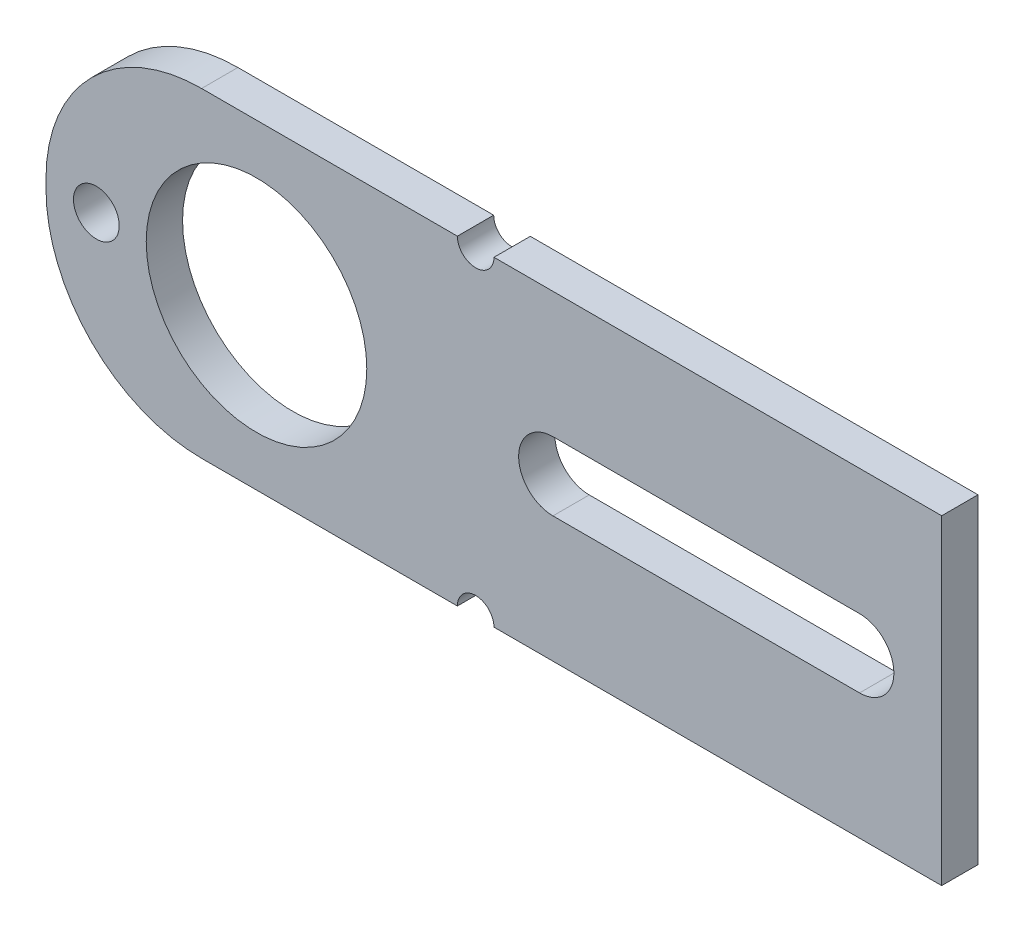
ISO-10303-21;
HEADER;
FILE_DESCRIPTION(('STEP AP214'),'2;1');
FILE_NAME('part.step','',(''),(''),'','','');
FILE_SCHEMA(('AUTOMOTIVE_DESIGN { 1 0 10303 214 1 1 1 1 }'));
ENDSEC;
DATA;
#1=APPLICATION_CONTEXT('core data for automotive mechanical design processes');
#2=APPLICATION_PROTOCOL_DEFINITION('international standard','automotive_design',2000,#1);
#3=PRODUCT_CONTEXT('',#1,'mechanical');
#4=PRODUCT('Part','Part','',(#3));
#5=PRODUCT_RELATED_PRODUCT_CATEGORY('part','',(#4));
#6=PRODUCT_DEFINITION_FORMATION('','',#4);
#7=PRODUCT_DEFINITION_CONTEXT('part definition',#1,'design');
#8=PRODUCT_DEFINITION('design','',#6,#7);
#9=PRODUCT_DEFINITION_SHAPE('','',#8);
#10=(LENGTH_UNIT() NAMED_UNIT(*) SI_UNIT(.MILLI.,.METRE.));
#11=(NAMED_UNIT(*) PLANE_ANGLE_UNIT() SI_UNIT($,.RADIAN.));
#12=(NAMED_UNIT(*) SI_UNIT($,.STERADIAN.) SOLID_ANGLE_UNIT());
#13=UNCERTAINTY_MEASURE_WITH_UNIT(LENGTH_MEASURE(1.E-05),#10,'distance_accuracy_value','');
#14=(GEOMETRIC_REPRESENTATION_CONTEXT(3) GLOBAL_UNCERTAINTY_ASSIGNED_CONTEXT((#13)) GLOBAL_UNIT_ASSIGNED_CONTEXT((#10,
#11,#12)) REPRESENTATION_CONTEXT('',''));
#15=CARTESIAN_POINT('',(0.,0.,0.));
#16=DIRECTION('',(0.,0.,1.));
#17=DIRECTION('',(1.,0.,0.));
#18=AXIS2_PLACEMENT_3D('',#15,#16,#17);
#19=CARTESIAN_POINT('',(-77.7752740873754,-35.,7.9375));
#20=DIRECTION('',(0.,-1.,0.));
#21=DIRECTION('',(1.,0.,0.));
#22=AXIS2_PLACEMENT_3D('',#19,#20,#21);
#23=PLANE('',#22);
#24=DIRECTION('',(0.,0.,1.));
#25=VECTOR('',#24,1.);
#26=CARTESIAN_POINT('',(-79.8833361460071,-35.,0.));
#27=LINE('',#26,#25);
#28=CARTESIAN_POINT('',(-79.8833361460071,-35.,0.));
#29=VERTEX_POINT('',#28);
#30=CARTESIAN_POINT('',(-79.8833361460071,-35.,7.9375));
#31=VERTEX_POINT('',#30);
#32=EDGE_CURVE('E139',#29,#31,#27,.T.);
#33=ORIENTED_EDGE('',*,*,#32,.F.);
#34=DIRECTION('',(1.,0.,0.));
#35=VECTOR('',#34,1.);
#36=CARTESIAN_POINT('',(-143.775274087375,-35.,0.));
#37=LINE('',#36,#35);
#38=CARTESIAN_POINT('',(17.9461017953612,-35.,0.));
#39=VERTEX_POINT('',#38);
#40=EDGE_CURVE('E150',#29,#39,#37,.T.);
#41=ORIENTED_EDGE('',*,*,#40,.T.);
#42=DIRECTION('',(0.,0.,1.));
#43=VECTOR('',#42,1.);
#44=CARTESIAN_POINT('',(17.9461017953612,-35.,7.9375));
#45=LINE('',#44,#43);
#46=CARTESIAN_POINT('',(17.9461017953612,-35.,7.9375));
#47=VERTEX_POINT('',#46);
#48=EDGE_CURVE('E227',#39,#47,#45,.T.);
#49=ORIENTED_EDGE('',*,*,#48,.T.);
#50=DIRECTION('',(1.,0.,0.));
#51=VECTOR('',#50,1.);
#52=CARTESIAN_POINT('',(-77.7752740873754,-35.,7.9375));
#53=LINE('',#52,#51);
#54=EDGE_CURVE('E152',#31,#47,#53,.T.);
#55=ORIENTED_EDGE('',*,*,#54,.F.);
#56=EDGE_LOOP('',(#33,#41,#49,#55));
#57=FACE_BOUND('',#56,.T.);
#58=ADVANCED_FACE('F39',(#57),#23,.T.);
#59=CARTESIAN_POINT('',(-77.7752740873754,35.,7.9375));
#60=DIRECTION('',(0.,1.,0.));
#61=DIRECTION('',(-1.,0.,0.));
#62=AXIS2_PLACEMENT_3D('',#59,#60,#61);
#63=PLANE('',#62);
#64=DIRECTION('',(0.,0.,1.));
#65=VECTOR('',#64,1.);
#66=CARTESIAN_POINT('',(-87.8833361460071,35.,0.));
#67=LINE('',#66,#65);
#68=CARTESIAN_POINT('',(-87.8833361460071,35.,0.));
#69=VERTEX_POINT('',#68);
#70=CARTESIAN_POINT('',(-87.8833361460071,35.,7.9375));
#71=VERTEX_POINT('',#70);
#72=EDGE_CURVE('E259',#69,#71,#67,.T.);
#73=ORIENTED_EDGE('',*,*,#72,.F.);
#74=DIRECTION('',(1.,0.,0.));
#75=VECTOR('',#74,1.);
#76=CARTESIAN_POINT('',(-143.775274087375,35.,0.));
#77=LINE('',#76,#75);
#78=CARTESIAN_POINT('',(-143.775274087375,35.,0.));
#79=VERTEX_POINT('',#78);
#80=EDGE_CURVE('E179',#69,#79,#77,.F.);
#81=ORIENTED_EDGE('',*,*,#80,.T.);
#82=DIRECTION('',(0.,0.,1.));
#83=VECTOR('',#82,1.);
#84=CARTESIAN_POINT('',(-143.775274087375,35.,7.9375));
#85=LINE('',#84,#83);
#86=CARTESIAN_POINT('',(-143.775274087375,35.,7.9375));
#87=VERTEX_POINT('',#86);
#88=EDGE_CURVE('E47',#79,#87,#85,.T.);
#89=ORIENTED_EDGE('',*,*,#88,.T.);
#90=DIRECTION('',(-1.,0.,0.));
#91=VECTOR('',#90,1.);
#92=CARTESIAN_POINT('',(-77.7752740873754,35.,7.9375));
#93=LINE('',#92,#91);
#94=EDGE_CURVE('E199',#71,#87,#93,.T.);
#95=ORIENTED_EDGE('',*,*,#94,.F.);
#96=EDGE_LOOP('',(#73,#81,#89,#95));
#97=FACE_BOUND('',#96,.T.);
#98=ADVANCED_FACE('F198',(#97),#63,.T.);
#99=DIRECTION('',(0.,0.,1.));
#100=VECTOR('',#99,1.);
#101=CARTESIAN_POINT('',(-79.8833361460071,35.,0.));
#102=LINE('',#101,#100);
#103=CARTESIAN_POINT('',(-79.8833361460071,35.,7.9375));
#104=VERTEX_POINT('',#103);
#105=CARTESIAN_POINT('',(-79.8833361460071,35.,0.));
#106=VERTEX_POINT('',#105);
#107=EDGE_CURVE('E62',#104,#106,#102,.F.);
#108=ORIENTED_EDGE('',*,*,#107,.F.);
#109=CARTESIAN_POINT('',(17.9461017953612,35.,7.9375));
#110=VERTEX_POINT('',#109);
#111=EDGE_CURVE('E210',#110,#104,#93,.T.);
#112=ORIENTED_EDGE('',*,*,#111,.F.);
#113=DIRECTION('',(0.,0.,1.));
#114=VECTOR('',#113,1.);
#115=CARTESIAN_POINT('',(17.9461017953612,35.,7.9375));
#116=LINE('',#115,#114);
#117=CARTESIAN_POINT('',(17.9461017953612,35.,0.));
#118=VERTEX_POINT('',#117);
#119=EDGE_CURVE('E234',#118,#110,#116,.T.);
#120=ORIENTED_EDGE('',*,*,#119,.F.);
#121=EDGE_CURVE('E176',#118,#106,#77,.F.);
#122=ORIENTED_EDGE('',*,*,#121,.T.);
#123=EDGE_LOOP('',(#108,#112,#120,#122));
#124=FACE_BOUND('',#123,.T.);
#125=ADVANCED_FACE('F311',(#124),#63,.T.);
#126=CARTESIAN_POINT('',(-143.775274087375,0.99999999999998,7.9375));
#127=DIRECTION('',(0.,0.,1.));
#128=DIRECTION('',(1.,0.,0.));
#129=AXIS2_PLACEMENT_3D('',#126,#127,#128);
#130=CYLINDRICAL_SURFACE('',#129,34.);
#131=ORIENTED_EDGE('',*,*,#88,.F.);
#132=CARTESIAN_POINT('',(-143.775274087375,0.99999999999998,0.));
#133=DIRECTION('',(0.,0.,1.));
#134=DIRECTION('',(1.,0.,0.));
#135=AXIS2_PLACEMENT_3D('',#132,#133,#134);
#136=CIRCLE('',#135,34.);
#137=CARTESIAN_POINT('',(-177.775274087375,0.99999999999998,0.));
#138=VERTEX_POINT('',#137);
#139=EDGE_CURVE('E173',#79,#138,#136,.T.);
#140=ORIENTED_EDGE('',*,*,#139,.T.);
#141=DIRECTION('',(0.,0.,1.));
#142=VECTOR('',#141,1.);
#143=CARTESIAN_POINT('',(-177.775274087375,0.99999999999998,7.9375));
#144=LINE('',#143,#142);
#145=CARTESIAN_POINT('',(-177.775274087375,0.99999999999998,7.9375));
#146=VERTEX_POINT('',#145);
#147=EDGE_CURVE('E191',#138,#146,#144,.T.);
#148=ORIENTED_EDGE('',*,*,#147,.T.);
#149=CARTESIAN_POINT('',(-143.775274087375,0.99999999999998,7.9375));
#150=DIRECTION('',(0.,0.,1.));
#151=DIRECTION('',(1.,0.,0.));
#152=AXIS2_PLACEMENT_3D('',#149,#150,#151);
#153=CIRCLE('',#152,34.);
#154=EDGE_CURVE('E204',#87,#146,#153,.T.);
#155=ORIENTED_EDGE('',*,*,#154,.F.);
#156=EDGE_LOOP('',(#131,#140,#148,#155));
#157=FACE_BOUND('',#156,.T.);
#158=ADVANCED_FACE('F205',(#157),#130,.T.);
#159=CARTESIAN_POINT('',(-177.775274087375,-1.,7.9375));
#160=DIRECTION('',(-1.,0.,0.));
#161=DIRECTION('',(0.,-1.,0.));
#162=AXIS2_PLACEMENT_3D('',#159,#160,#161);
#163=PLANE('',#162);
#164=ORIENTED_EDGE('',*,*,#147,.F.);
#165=DIRECTION('',(0.,1.,0.));
#166=VECTOR('',#165,1.);
#167=CARTESIAN_POINT('',(-177.775274087375,0.99999999999998,0.));
#168=LINE('',#167,#166);
#169=CARTESIAN_POINT('',(-177.775274087375,-1.,0.));
#170=VERTEX_POINT('',#169);
#171=EDGE_CURVE('E165',#138,#170,#168,.F.);
#172=ORIENTED_EDGE('',*,*,#171,.T.);
#173=DIRECTION('',(0.,0.,1.));
#174=VECTOR('',#173,1.);
#175=CARTESIAN_POINT('',(-177.775274087375,-1.,7.9375));
#176=LINE('',#175,#174);
#177=CARTESIAN_POINT('',(-177.775274087375,-1.,7.9375));
#178=VERTEX_POINT('',#177);
#179=EDGE_CURVE('E189',#170,#178,#176,.T.);
#180=ORIENTED_EDGE('',*,*,#179,.T.);
#181=DIRECTION('',(0.,-1.,0.));
#182=VECTOR('',#181,1.);
#183=CARTESIAN_POINT('',(-177.775274087375,-1.,7.9375));
#184=LINE('',#183,#182);
#185=EDGE_CURVE('E209',#146,#178,#184,.T.);
#186=ORIENTED_EDGE('',*,*,#185,.F.);
#187=EDGE_LOOP('',(#164,#172,#180,#186));
#188=FACE_BOUND('',#187,.T.);
#189=ADVANCED_FACE('F322',(#188),#163,.T.);
#190=CARTESIAN_POINT('',(-143.775274087375,-1.,7.9375));
#191=DIRECTION('',(0.,0.,1.));
#192=DIRECTION('',(1.,0.,0.));
#193=AXIS2_PLACEMENT_3D('',#190,#191,#192);
#194=CYLINDRICAL_SURFACE('',#193,34.);
#195=ORIENTED_EDGE('',*,*,#179,.F.);
#196=CARTESIAN_POINT('',(-143.775274087375,-1.,0.));
#197=DIRECTION('',(0.,0.,1.));
#198=DIRECTION('',(1.,0.,0.));
#199=AXIS2_PLACEMENT_3D('',#196,#197,#198);
#200=CIRCLE('',#199,34.);
#201=CARTESIAN_POINT('',(-143.775274087375,-35.,0.));
#202=VERTEX_POINT('',#201);
#203=EDGE_CURVE('E161',#170,#202,#200,.T.);
#204=ORIENTED_EDGE('',*,*,#203,.T.);
#205=DIRECTION('',(0.,0.,1.));
#206=VECTOR('',#205,1.);
#207=CARTESIAN_POINT('',(-143.775274087375,-35.,7.9375));
#208=LINE('',#207,#206);
#209=CARTESIAN_POINT('',(-143.775274087375,-35.,7.9375));
#210=VERTEX_POINT('',#209);
#211=EDGE_CURVE('E187',#202,#210,#208,.T.);
#212=ORIENTED_EDGE('',*,*,#211,.T.);
#213=CARTESIAN_POINT('',(-143.775274087375,-1.,7.9375));
#214=DIRECTION('',(0.,0.,1.));
#215=DIRECTION('',(-1.,0.,0.));
#216=AXIS2_PLACEMENT_3D('',#213,#214,#215);
#217=CIRCLE('',#216,34.);
#218=EDGE_CURVE('E212',#178,#210,#217,.T.);
#219=ORIENTED_EDGE('',*,*,#218,.F.);
#220=EDGE_LOOP('',(#195,#204,#212,#219));
#221=FACE_BOUND('',#220,.T.);
#222=ADVANCED_FACE('F315',(#221),#194,.T.);
#223=DIRECTION('',(0.,0.,1.));
#224=VECTOR('',#223,1.);
#225=CARTESIAN_POINT('',(-87.8833361460071,-35.,0.));
#226=LINE('',#225,#224);
#227=CARTESIAN_POINT('',(-87.8833361460071,-35.,7.9375));
#228=VERTEX_POINT('',#227);
#229=CARTESIAN_POINT('',(-87.8833361460071,-35.,0.));
#230=VERTEX_POINT('',#229);
#231=EDGE_CURVE('E54',#228,#230,#226,.F.);
#232=ORIENTED_EDGE('',*,*,#231,.F.);
#233=EDGE_CURVE('E219',#210,#228,#53,.T.);
#234=ORIENTED_EDGE('',*,*,#233,.F.);
#235=ORIENTED_EDGE('',*,*,#211,.F.);
#236=EDGE_CURVE('E160',#202,#230,#37,.T.);
#237=ORIENTED_EDGE('',*,*,#236,.T.);
#238=EDGE_LOOP('',(#232,#234,#235,#237));
#239=FACE_BOUND('',#238,.T.);
#240=ADVANCED_FACE('F307',(#239),#23,.T.);
#241=CARTESIAN_POINT('',(-131.775274087375,0.,7.9375));
#242=DIRECTION('',(0.,0.,1.));
#243=DIRECTION('',(1.,0.,0.));
#244=AXIS2_PLACEMENT_3D('',#241,#242,#243);
#245=CYLINDRICAL_SURFACE('',#244,24.1);
#246=CARTESIAN_POINT('',(-131.775274087375,0.,7.9375));
#247=DIRECTION('',(0.,0.,1.));
#248=DIRECTION('',(1.,0.,0.));
#249=AXIS2_PLACEMENT_3D('',#246,#247,#248);
#250=CIRCLE('',#249,24.1);
#251=CARTESIAN_POINT('',(-107.675274087375,0.,7.9375));
#252=VERTEX_POINT('',#251);
#253=EDGE_CURVE('E186',#252,#252,#250,.T.);
#254=ORIENTED_EDGE('',*,*,#253,.T.);
#255=EDGE_LOOP('',(#254));
#256=FACE_BOUND('',#255,.T.);
#257=CARTESIAN_POINT('',(-131.775274087375,0.,0.));
#258=DIRECTION('',(0.,0.,1.));
#259=DIRECTION('',(1.,0.,0.));
#260=AXIS2_PLACEMENT_3D('',#257,#258,#259);
#261=CIRCLE('',#260,24.1);
#262=CARTESIAN_POINT('',(-107.675274087375,0.,0.));
#263=VERTEX_POINT('',#262);
#264=EDGE_CURVE('E180',#263,#263,#261,.T.);
#265=ORIENTED_EDGE('',*,*,#264,.F.);
#266=EDGE_LOOP('',(#265));
#267=FACE_BOUND('',#266,.T.);
#268=ADVANCED_FACE('F303',(#256,#267),#245,.F.);
#269=CARTESIAN_POINT('',(-166.775274087375,0.,7.9375));
#270=DIRECTION('',(0.,0.,1.));
#271=DIRECTION('',(1.,0.,0.));
#272=AXIS2_PLACEMENT_3D('',#269,#270,#271);
#273=CYLINDRICAL_SURFACE('',#272,5.);
#274=CARTESIAN_POINT('',(-166.775274087375,0.,7.9375));
#275=DIRECTION('',(0.,0.,1.));
#276=DIRECTION('',(1.,0.,0.));
#277=AXIS2_PLACEMENT_3D('',#274,#275,#276);
#278=CIRCLE('',#277,5.);
#279=CARTESIAN_POINT('',(-161.775274087375,0.,7.9375));
#280=VERTEX_POINT('',#279);
#281=EDGE_CURVE('E168',#280,#280,#278,.T.);
#282=ORIENTED_EDGE('',*,*,#281,.T.);
#283=EDGE_LOOP('',(#282));
#284=FACE_BOUND('',#283,.T.);
#285=CARTESIAN_POINT('',(-166.775274087375,0.,0.));
#286=DIRECTION('',(0.,0.,1.));
#287=DIRECTION('',(1.,0.,0.));
#288=AXIS2_PLACEMENT_3D('',#285,#286,#287);
#289=CIRCLE('',#288,5.);
#290=CARTESIAN_POINT('',(-161.775274087375,0.,0.));
#291=VERTEX_POINT('',#290);
#292=EDGE_CURVE('E163',#291,#291,#289,.T.);
#293=ORIENTED_EDGE('',*,*,#292,.F.);
#294=EDGE_LOOP('',(#293));
#295=FACE_BOUND('',#294,.T.);
#296=ADVANCED_FACE('F296',(#284,#295),#273,.F.);
#297=CARTESIAN_POINT('',(0.,0.,7.9375));
#298=DIRECTION('',(0.,0.,1.));
#299=DIRECTION('',(1.,0.,0.));
#300=AXIS2_PLACEMENT_3D('',#297,#298,#299);
#301=PLANE('',#300);
#302=CARTESIAN_POINT('',(-83.8833361460071,-35.,7.9375));
#303=DIRECTION('',(0.,0.,1.));
#304=DIRECTION('',(1.,0.,0.));
#305=AXIS2_PLACEMENT_3D('',#302,#303,#304);
#306=CIRCLE('',#305,4.00000000000001);
#307=EDGE_CURVE('E145',#31,#228,#306,.T.);
#308=ORIENTED_EDGE('',*,*,#307,.F.);
#309=ORIENTED_EDGE('',*,*,#54,.T.);
#310=DIRECTION('',(0.,1.,0.));
#311=VECTOR('',#310,1.);
#312=CARTESIAN_POINT('',(17.9461017953612,35.,7.9375));
#313=LINE('',#312,#311);
#314=EDGE_CURVE('E226',#47,#110,#313,.T.);
#315=ORIENTED_EDGE('',*,*,#314,.T.);
#316=ORIENTED_EDGE('',*,*,#111,.T.);
#317=CARTESIAN_POINT('',(-83.8833361460071,35.,7.9375));
#318=DIRECTION('',(0.,0.,1.));
#319=DIRECTION('',(1.,0.,0.));
#320=AXIS2_PLACEMENT_3D('',#317,#318,#319);
#321=CIRCLE('',#320,4.00000000000001);
#322=EDGE_CURVE('E153',#71,#104,#321,.T.);
#323=ORIENTED_EDGE('',*,*,#322,.F.);
#324=ORIENTED_EDGE('',*,*,#94,.T.);
#325=ORIENTED_EDGE('',*,*,#154,.T.);
#326=ORIENTED_EDGE('',*,*,#185,.T.);
#327=ORIENTED_EDGE('',*,*,#218,.T.);
#328=ORIENTED_EDGE('',*,*,#233,.T.);
#329=EDGE_LOOP('',(#308,#309,#315,#316,#323,#324,#325,#326,#327,#328));
#330=FACE_BOUND('',#329,.T.);
#331=ORIENTED_EDGE('',*,*,#253,.F.);
#332=EDGE_LOOP('',(#331));
#333=FACE_BOUND('',#332,.T.);
#334=ORIENTED_EDGE('',*,*,#281,.F.);
#335=EDGE_LOOP('',(#334));
#336=FACE_BOUND('',#335,.T.);
#337=DIRECTION('',(1.,0.,0.));
#338=VECTOR('',#337,1.);
#339=CARTESIAN_POINT('',(-67.,-7.5,7.9375));
#340=LINE('',#339,#338);
#341=CARTESIAN_POINT('',(-67.,-7.5,7.9375));
#342=VERTEX_POINT('',#341);
#343=CARTESIAN_POINT('',(0.,-7.5,7.9375));
#344=VERTEX_POINT('',#343);
#345=EDGE_CURVE('E240',#342,#344,#340,.T.);
#346=ORIENTED_EDGE('',*,*,#345,.F.);
#347=CARTESIAN_POINT('',(-67.,0.,7.9375));
#348=DIRECTION('',(0.,0.,1.));
#349=DIRECTION('',(1.,0.,0.));
#350=AXIS2_PLACEMENT_3D('',#347,#348,#349);
#351=CIRCLE('',#350,7.5);
#352=CARTESIAN_POINT('',(-67.,7.5,7.9375));
#353=VERTEX_POINT('',#352);
#354=EDGE_CURVE('E245',#353,#342,#351,.T.);
#355=ORIENTED_EDGE('',*,*,#354,.F.);
#356=DIRECTION('',(-1.,0.,0.));
#357=VECTOR('',#356,1.);
#358=CARTESIAN_POINT('',(-67.,7.5,7.9375));
#359=LINE('',#358,#357);
#360=CARTESIAN_POINT('',(0.,7.5,7.9375));
#361=VERTEX_POINT('',#360);
#362=EDGE_CURVE('E250',#361,#353,#359,.T.);
#363=ORIENTED_EDGE('',*,*,#362,.F.);
#364=CARTESIAN_POINT('',(0.,0.,7.9375));
#365=DIRECTION('',(0.,0.,1.));
#366=DIRECTION('',(1.,0.,0.));
#367=AXIS2_PLACEMENT_3D('',#364,#365,#366);
#368=CIRCLE('',#367,7.5);
#369=EDGE_CURVE('E255',#344,#361,#368,.T.);
#370=ORIENTED_EDGE('',*,*,#369,.F.);
#371=EDGE_LOOP('',(#346,#355,#363,#370));
#372=FACE_BOUND('',#371,.T.);
#373=ADVANCED_FACE('F41',(#330,#333,#336,#372),#301,.T.);
#374=CARTESIAN_POINT('',(-143.775274087375,0.99999999999998,0.));
#375=DIRECTION('',(0.,0.,1.));
#376=DIRECTION('',(1.,0.,0.));
#377=AXIS2_PLACEMENT_3D('',#374,#375,#376);
#378=PLANE('',#377);
#379=ORIENTED_EDGE('',*,*,#264,.T.);
#380=EDGE_LOOP('',(#379));
#381=FACE_BOUND('',#380,.T.);
#382=ORIENTED_EDGE('',*,*,#40,.F.);
#383=CARTESIAN_POINT('',(-83.8833361460071,-35.,0.));
#384=DIRECTION('',(0.,0.,1.));
#385=DIRECTION('',(1.,0.,0.));
#386=AXIS2_PLACEMENT_3D('',#383,#384,#385);
#387=CIRCLE('',#386,4.00000000000001);
#388=EDGE_CURVE('E136',#29,#230,#387,.T.);
#389=ORIENTED_EDGE('',*,*,#388,.T.);
#390=ORIENTED_EDGE('',*,*,#236,.F.);
#391=ORIENTED_EDGE('',*,*,#203,.F.);
#392=ORIENTED_EDGE('',*,*,#171,.F.);
#393=ORIENTED_EDGE('',*,*,#139,.F.);
#394=ORIENTED_EDGE('',*,*,#80,.F.);
#395=CARTESIAN_POINT('',(-83.8833361460071,35.,0.));
#396=DIRECTION('',(0.,0.,1.));
#397=DIRECTION('',(1.,0.,0.));
#398=AXIS2_PLACEMENT_3D('',#395,#396,#397);
#399=CIRCLE('',#398,4.00000000000001);
#400=EDGE_CURVE('E12',#69,#106,#399,.T.);
#401=ORIENTED_EDGE('',*,*,#400,.T.);
#402=ORIENTED_EDGE('',*,*,#121,.F.);
#403=DIRECTION('',(0.,1.,0.));
#404=VECTOR('',#403,1.);
#405=CARTESIAN_POINT('',(17.9461017953612,0.,0.));
#406=LINE('',#405,#404);
#407=EDGE_CURVE('E159',#39,#118,#406,.T.);
#408=ORIENTED_EDGE('',*,*,#407,.F.);
#409=EDGE_LOOP('',(#382,#389,#390,#391,#392,#393,#394,#401,#402,#408));
#410=FACE_BOUND('',#409,.T.);
#411=ORIENTED_EDGE('',*,*,#292,.T.);
#412=EDGE_LOOP('',(#411));
#413=FACE_BOUND('',#412,.T.);
#414=DIRECTION('',(1.,0.,0.));
#415=VECTOR('',#414,1.);
#416=CARTESIAN_POINT('',(0.,-7.5,0.));
#417=LINE('',#416,#415);
#418=CARTESIAN_POINT('',(-67.,-7.5,0.));
#419=VERTEX_POINT('',#418);
#420=CARTESIAN_POINT('',(0.,-7.5,0.));
#421=VERTEX_POINT('',#420);
#422=EDGE_CURVE('E229',#419,#421,#417,.T.);
#423=ORIENTED_EDGE('',*,*,#422,.T.);
#424=CARTESIAN_POINT('',(0.,0.,0.));
#425=DIRECTION('',(0.,0.,1.));
#426=DIRECTION('',(1.,0.,0.));
#427=AXIS2_PLACEMENT_3D('',#424,#425,#426);
#428=CIRCLE('',#427,7.5);
#429=CARTESIAN_POINT('',(0.,7.5,0.));
#430=VERTEX_POINT('',#429);
#431=EDGE_CURVE('E274',#421,#430,#428,.T.);
#432=ORIENTED_EDGE('',*,*,#431,.T.);
#433=DIRECTION('',(1.,0.,0.));
#434=VECTOR('',#433,1.);
#435=CARTESIAN_POINT('',(0.,7.5,0.));
#436=LINE('',#435,#434);
#437=CARTESIAN_POINT('',(-67.,7.5,0.));
#438=VERTEX_POINT('',#437);
#439=EDGE_CURVE('E271',#430,#438,#436,.F.);
#440=ORIENTED_EDGE('',*,*,#439,.T.);
#441=CARTESIAN_POINT('',(-67.,0.,0.));
#442=DIRECTION('',(0.,0.,1.));
#443=DIRECTION('',(1.,0.,0.));
#444=AXIS2_PLACEMENT_3D('',#441,#442,#443);
#445=CIRCLE('',#444,7.5);
#446=EDGE_CURVE('E183',#438,#419,#445,.T.);
#447=ORIENTED_EDGE('',*,*,#446,.T.);
#448=EDGE_LOOP('',(#423,#432,#440,#447));
#449=FACE_BOUND('',#448,.T.);
#450=ADVANCED_FACE('F156',(#381,#410,#413,#449),#378,.F.);
#451=CARTESIAN_POINT('',(0.,0.,7.9375));
#452=DIRECTION('',(0.,0.,1.));
#453=DIRECTION('',(1.,0.,0.));
#454=AXIS2_PLACEMENT_3D('',#451,#452,#453);
#455=CYLINDRICAL_SURFACE('',#454,7.5);
#456=DIRECTION('',(0.,0.,1.));
#457=VECTOR('',#456,1.);
#458=CARTESIAN_POINT('',(0.,7.5,7.9375));
#459=LINE('',#458,#457);
#460=EDGE_CURVE('E253',#430,#361,#459,.T.);
#461=ORIENTED_EDGE('',*,*,#460,.F.);
#462=ORIENTED_EDGE('',*,*,#431,.F.);
#463=DIRECTION('',(0.,0.,1.));
#464=VECTOR('',#463,1.);
#465=CARTESIAN_POINT('',(0.,-7.5,7.9375));
#466=LINE('',#465,#464);
#467=EDGE_CURVE('E258',#421,#344,#466,.T.);
#468=ORIENTED_EDGE('',*,*,#467,.T.);
#469=ORIENTED_EDGE('',*,*,#369,.T.);
#470=EDGE_LOOP('',(#461,#462,#468,#469));
#471=FACE_BOUND('',#470,.T.);
#472=ADVANCED_FACE('F283',(#471),#455,.F.);
#473=CARTESIAN_POINT('',(-67.,7.5,7.9375));
#474=DIRECTION('',(0.,1.,0.));
#475=DIRECTION('',(-1.,0.,0.));
#476=AXIS2_PLACEMENT_3D('',#473,#474,#475);
#477=PLANE('',#476);
#478=DIRECTION('',(0.,0.,1.));
#479=VECTOR('',#478,1.);
#480=CARTESIAN_POINT('',(-67.,7.5,7.9375));
#481=LINE('',#480,#479);
#482=EDGE_CURVE('E248',#438,#353,#481,.T.);
#483=ORIENTED_EDGE('',*,*,#482,.F.);
#484=ORIENTED_EDGE('',*,*,#439,.F.);
#485=ORIENTED_EDGE('',*,*,#460,.T.);
#486=ORIENTED_EDGE('',*,*,#362,.T.);
#487=EDGE_LOOP('',(#483,#484,#485,#486));
#488=FACE_BOUND('',#487,.T.);
#489=ADVANCED_FACE('F288',(#488),#477,.F.);
#490=CARTESIAN_POINT('',(-67.,0.,7.9375));
#491=DIRECTION('',(0.,0.,1.));
#492=DIRECTION('',(1.,0.,0.));
#493=AXIS2_PLACEMENT_3D('',#490,#491,#492);
#494=CYLINDRICAL_SURFACE('',#493,7.5);
#495=ORIENTED_EDGE('',*,*,#446,.F.);
#496=ORIENTED_EDGE('',*,*,#482,.T.);
#497=ORIENTED_EDGE('',*,*,#354,.T.);
#498=DIRECTION('',(0.,0.,1.));
#499=VECTOR('',#498,1.);
#500=CARTESIAN_POINT('',(-67.,-7.5,7.9375));
#501=LINE('',#500,#499);
#502=EDGE_CURVE('E243',#419,#342,#501,.T.);
#503=ORIENTED_EDGE('',*,*,#502,.F.);
#504=EDGE_LOOP('',(#495,#496,#497,#503));
#505=FACE_BOUND('',#504,.T.);
#506=ADVANCED_FACE('F290',(#505),#494,.F.);
#507=CARTESIAN_POINT('',(-67.,-7.5,7.9375));
#508=DIRECTION('',(0.,-1.,0.));
#509=DIRECTION('',(1.,0.,0.));
#510=AXIS2_PLACEMENT_3D('',#507,#508,#509);
#511=PLANE('',#510);
#512=ORIENTED_EDGE('',*,*,#467,.F.);
#513=ORIENTED_EDGE('',*,*,#422,.F.);
#514=ORIENTED_EDGE('',*,*,#502,.T.);
#515=ORIENTED_EDGE('',*,*,#345,.T.);
#516=EDGE_LOOP('',(#512,#513,#514,#515));
#517=FACE_BOUND('',#516,.T.);
#518=ADVANCED_FACE('F293',(#517),#511,.F.);
#519=CARTESIAN_POINT('',(17.9461017953612,35.,7.9375));
#520=DIRECTION('',(1.,0.,0.));
#521=DIRECTION('',(0.,1.,0.));
#522=AXIS2_PLACEMENT_3D('',#519,#520,#521);
#523=PLANE('',#522);
#524=ORIENTED_EDGE('',*,*,#48,.F.);
#525=ORIENTED_EDGE('',*,*,#407,.T.);
#526=ORIENTED_EDGE('',*,*,#119,.T.);
#527=ORIENTED_EDGE('',*,*,#314,.F.);
#528=EDGE_LOOP('',(#524,#525,#526,#527));
#529=FACE_BOUND('',#528,.T.);
#530=ADVANCED_FACE('F232',(#529),#523,.T.);
#531=CARTESIAN_POINT('',(-83.8833361460071,35.,0.));
#532=DIRECTION('',(0.,0.,1.));
#533=DIRECTION('',(1.,0.,0.));
#534=AXIS2_PLACEMENT_3D('',#531,#532,#533);
#535=CYLINDRICAL_SURFACE('',#534,4.00000000000001);
#536=ORIENTED_EDGE('',*,*,#72,.T.);
#537=ORIENTED_EDGE('',*,*,#322,.T.);
#538=ORIENTED_EDGE('',*,*,#107,.T.);
#539=ORIENTED_EDGE('',*,*,#400,.F.);
#540=EDGE_LOOP('',(#536,#537,#538,#539));
#541=FACE_BOUND('',#540,.T.);
#542=ADVANCED_FACE('F407',(#541),#535,.F.);
#543=CARTESIAN_POINT('',(-83.8833361460071,-35.,0.));
#544=DIRECTION('',(0.,0.,1.));
#545=DIRECTION('',(1.,0.,0.));
#546=AXIS2_PLACEMENT_3D('',#543,#544,#545);
#547=CYLINDRICAL_SURFACE('',#546,4.00000000000001);
#548=ORIENTED_EDGE('',*,*,#32,.T.);
#549=ORIENTED_EDGE('',*,*,#307,.T.);
#550=ORIENTED_EDGE('',*,*,#231,.T.);
#551=ORIENTED_EDGE('',*,*,#388,.F.);
#552=EDGE_LOOP('',(#548,#549,#550,#551));
#553=FACE_BOUND('',#552,.T.);
#554=ADVANCED_FACE('F138',(#553),#547,.F.);
#555=CLOSED_SHELL('',(#58,#98,#125,#158,#189,#222,#240,#268,#296,#373,#450,#472,#489,#506,#518,
#530,#542,#554));
#556=MANIFOLD_SOLID_BREP('B2',#555);
#557=ADVANCED_BREP_SHAPE_REPRESENTATION('',(#18,#556),#14);
#558=SHAPE_DEFINITION_REPRESENTATION(#9,#557);
ENDSEC;
END-ISO-10303-21;
